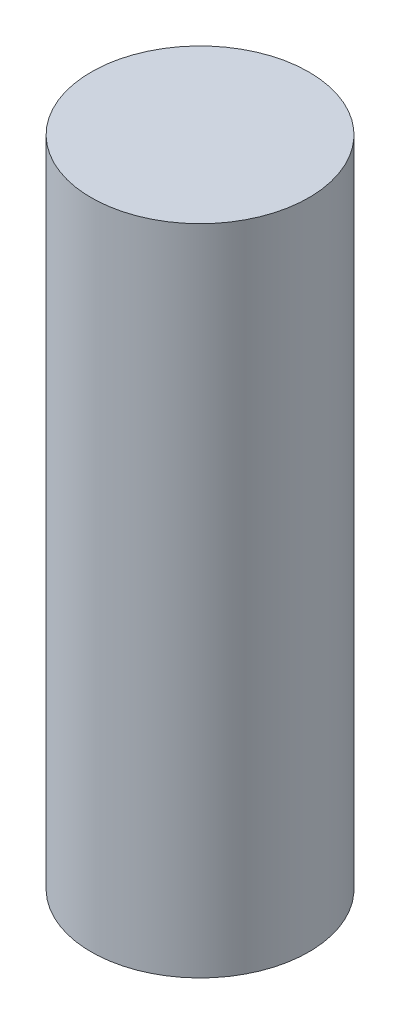
ISO-10303-21;
HEADER;
FILE_DESCRIPTION(('STEP AP214'),'2;1');
FILE_NAME('part.step','',(''),(''),'','','');
FILE_SCHEMA(('AUTOMOTIVE_DESIGN { 1 0 10303 214 1 1 1 1 }'));
ENDSEC;
DATA;
#1=APPLICATION_CONTEXT('core data for automotive mechanical design processes');
#2=APPLICATION_PROTOCOL_DEFINITION('international standard','automotive_design',2000,#1);
#3=PRODUCT_CONTEXT('',#1,'mechanical');
#4=PRODUCT('Part','Part','',(#3));
#5=PRODUCT_RELATED_PRODUCT_CATEGORY('part','',(#4));
#6=PRODUCT_DEFINITION_FORMATION('','',#4);
#7=PRODUCT_DEFINITION_CONTEXT('part definition',#1,'design');
#8=PRODUCT_DEFINITION('design','',#6,#7);
#9=PRODUCT_DEFINITION_SHAPE('','',#8);
#10=(LENGTH_UNIT() NAMED_UNIT(*) SI_UNIT(.MILLI.,.METRE.));
#11=(NAMED_UNIT(*) PLANE_ANGLE_UNIT() SI_UNIT($,.RADIAN.));
#12=(NAMED_UNIT(*) SI_UNIT($,.STERADIAN.) SOLID_ANGLE_UNIT());
#13=UNCERTAINTY_MEASURE_WITH_UNIT(LENGTH_MEASURE(1.E-05),#10,'distance_accuracy_value','');
#14=(GEOMETRIC_REPRESENTATION_CONTEXT(3) GLOBAL_UNCERTAINTY_ASSIGNED_CONTEXT((#13)) GLOBAL_UNIT_ASSIGNED_CONTEXT((#10,
#11,#12)) REPRESENTATION_CONTEXT('',''));
#15=CARTESIAN_POINT('',(0.,0.,0.));
#16=DIRECTION('',(0.,0.,1.));
#17=DIRECTION('',(1.,0.,0.));
#18=AXIS2_PLACEMENT_3D('',#15,#16,#17);
#19=CARTESIAN_POINT('',(0.,19.05,0.));
#20=DIRECTION('',(0.,-1.,0.));
#21=DIRECTION('',(0.,0.,-1.));
#22=AXIS2_PLACEMENT_3D('',#19,#20,#21);
#23=CYLINDRICAL_SURFACE('',#22,3.175);
#24=CARTESIAN_POINT('',(0.,19.05,0.));
#25=DIRECTION('',(0.,1.,0.));
#26=DIRECTION('',(0.,0.,1.));
#27=AXIS2_PLACEMENT_3D('',#24,#25,#26);
#28=CIRCLE('',#27,3.175);
#29=CARTESIAN_POINT('',(0.,19.05,-3.175));
#30=VERTEX_POINT('',#29);
#31=EDGE_CURVE('E10',#30,#30,#28,.T.);
#32=CARTESIAN_POINT('',(0.,0.,0.));
#33=DIRECTION('',(0.,1.,0.));
#34=DIRECTION('',(0.,0.,1.));
#35=AXIS2_PLACEMENT_3D('',#32,#33,#34);
#36=CIRCLE('',#35,3.175);
#37=CARTESIAN_POINT('',(0.,0.,-3.175));
#38=VERTEX_POINT('',#37);
#39=EDGE_CURVE('E34',#38,#38,#36,.T.);
#40=CARTESIAN_POINT('',(0.,19.05,-3.175));
#41=CARTESIAN_POINT('',(0.,18.8515625,-3.175));
#42=CARTESIAN_POINT('',(0.,18.653125,-3.175));
#43=CARTESIAN_POINT('',(0.,18.25625,-3.175));
#44=CARTESIAN_POINT('',(0.,18.0578125,-3.175));
#45=CARTESIAN_POINT('',(0.,17.6609375,-3.175));
#46=CARTESIAN_POINT('',(0.,17.4625,-3.175));
#47=CARTESIAN_POINT('',(0.,17.065625,-3.175));
#48=CARTESIAN_POINT('',(0.,16.8671875,-3.175));
#49=CARTESIAN_POINT('',(0.,16.4703125,-3.175));
#50=CARTESIAN_POINT('',(0.,16.271875,-3.175));
#51=CARTESIAN_POINT('',(0.,15.875,-3.175));
#52=CARTESIAN_POINT('',(0.,15.6765625,-3.175));
#53=CARTESIAN_POINT('',(0.,15.2796875,-3.175));
#54=CARTESIAN_POINT('',(0.,15.08125,-3.175));
#55=CARTESIAN_POINT('',(0.,14.684375,-3.175));
#56=CARTESIAN_POINT('',(0.,14.4859375,-3.175));
#57=CARTESIAN_POINT('',(0.,14.0890625,-3.175));
#58=CARTESIAN_POINT('',(0.,13.890625,-3.175));
#59=CARTESIAN_POINT('',(0.,13.49375,-3.175));
#60=CARTESIAN_POINT('',(0.,13.2953125,-3.175));
#61=CARTESIAN_POINT('',(0.,12.8984375,-3.175));
#62=CARTESIAN_POINT('',(0.,12.7,-3.175));
#63=CARTESIAN_POINT('',(0.,12.303125,-3.175));
#64=CARTESIAN_POINT('',(0.,12.1046875,-3.175));
#65=CARTESIAN_POINT('',(0.,11.7078125,-3.175));
#66=CARTESIAN_POINT('',(0.,11.509375,-3.175));
#67=CARTESIAN_POINT('',(0.,11.1125,-3.175));
#68=CARTESIAN_POINT('',(0.,10.9140625,-3.175));
#69=CARTESIAN_POINT('',(0.,10.5171875,-3.175));
#70=CARTESIAN_POINT('',(0.,10.31875,-3.175));
#71=CARTESIAN_POINT('',(0.,9.921875,-3.175));
#72=CARTESIAN_POINT('',(0.,9.7234375,-3.175));
#73=CARTESIAN_POINT('',(0.,9.3265625,-3.175));
#74=CARTESIAN_POINT('',(0.,9.128125,-3.175));
#75=CARTESIAN_POINT('',(0.,8.73125,-3.175));
#76=CARTESIAN_POINT('',(0.,8.5328125,-3.175));
#77=CARTESIAN_POINT('',(0.,8.1359375,-3.175));
#78=CARTESIAN_POINT('',(0.,7.9375,-3.175));
#79=CARTESIAN_POINT('',(0.,7.540625,-3.175));
#80=CARTESIAN_POINT('',(0.,7.3421875,-3.175));
#81=CARTESIAN_POINT('',(0.,6.9453125,-3.175));
#82=CARTESIAN_POINT('',(0.,6.746875,-3.175));
#83=CARTESIAN_POINT('',(0.,6.35,-3.175));
#84=CARTESIAN_POINT('',(0.,6.1515625,-3.175));
#85=CARTESIAN_POINT('',(0.,5.7546875,-3.175));
#86=CARTESIAN_POINT('',(0.,5.55625,-3.175));
#87=CARTESIAN_POINT('',(0.,5.159375,-3.175));
#88=CARTESIAN_POINT('',(0.,4.9609375,-3.175));
#89=CARTESIAN_POINT('',(0.,4.5640625,-3.175));
#90=CARTESIAN_POINT('',(0.,4.365625,-3.175));
#91=CARTESIAN_POINT('',(0.,3.96875,-3.175));
#92=CARTESIAN_POINT('',(0.,3.7703125,-3.175));
#93=CARTESIAN_POINT('',(0.,3.3734375,-3.175));
#94=CARTESIAN_POINT('',(0.,3.175,-3.175));
#95=CARTESIAN_POINT('',(0.,2.778125,-3.175));
#96=CARTESIAN_POINT('',(0.,2.5796875,-3.175));
#97=CARTESIAN_POINT('',(0.,2.1828125,-3.175));
#98=CARTESIAN_POINT('',(0.,1.984375,-3.175));
#99=CARTESIAN_POINT('',(0.,1.5875,-3.175));
#100=CARTESIAN_POINT('',(0.,1.3890625,-3.175));
#101=CARTESIAN_POINT('',(0.,0.992187500000001,-3.175));
#102=CARTESIAN_POINT('',(0.,0.793750000000001,-3.175));
#103=CARTESIAN_POINT('',(0.,0.396875,-3.175));
#104=CARTESIAN_POINT('',(0.,0.1984375,-3.175));
#105=CARTESIAN_POINT('',(0.,0.,-3.175));
#106=B_SPLINE_CURVE_WITH_KNOTS('',3,(#40,#41,#42,#43,#44,#45,#46,#47,#48,#49,#50,#51,#52,#53,
#54,#55,#56,#57,#58,#59,#60,#61,#62,#63,#64,#65,#66,#67,#68,#69,#70,#71,#72,#73,#74,#75,#76,#77,
#78,#79,#80,#81,#82,#83,#84,#85,#86,#87,#88,#89,#90,#91,#92,#93,#94,#95,#96,#97,#98,#99,#100,
#101,#102,#103,#104,#105),.UNSPECIFIED.,.F.,.F.,(4,2,2,2,2,2,2,2,2,2,2,2,2,2,2,2,2,2,2,2,2,2,2,
2,2,2,2,2,2,2,2,2,4),(0.,0.595312499999997,1.190625,1.7859375,2.38125,2.9765625,3.571875,
4.1671875,4.7625,5.3578125,5.953125,6.5484375,7.14375,7.7390625,8.334375,8.9296875,9.525,
10.1203125,10.715625,11.3109375,11.90625,12.5015625,13.096875,13.6921875,14.2875,14.8828125,
15.478125,16.0734375,16.66875,17.2640625,17.859375,18.4546875,19.05),.UNSPECIFIED.);
#107=EDGE_CURVE('BSEAM31',#30,#38,#106,.T.);
#108=ORIENTED_EDGE('',*,*,#31,.F.);
#109=ORIENTED_EDGE('',*,*,#39,.T.);
#110=ORIENTED_EDGE('',*,*,#107,.T.);
#111=ORIENTED_EDGE('',*,*,#107,.F.);
#112=EDGE_LOOP('',(#108,#110,#109,#111));
#113=FACE_BOUND('',#112,.T.);
#114=ADVANCED_FACE('F31',(#113),#23,.T.);
#115=CARTESIAN_POINT('',(0.,19.05,0.));
#116=DIRECTION('',(0.,1.,0.));
#117=DIRECTION('',(0.,0.,1.));
#118=AXIS2_PLACEMENT_3D('',#115,#116,#117);
#119=PLANE('',#118);
#120=ORIENTED_EDGE('',*,*,#31,.T.);
#121=EDGE_LOOP('',(#120));
#122=FACE_BOUND('',#121,.T.);
#123=ADVANCED_FACE('F46',(#122),#119,.T.);
#124=CARTESIAN_POINT('',(0.,0.,0.));
#125=DIRECTION('',(0.,1.,0.));
#126=DIRECTION('',(0.,0.,1.));
#127=AXIS2_PLACEMENT_3D('',#124,#125,#126);
#128=PLANE('',#127);
#129=ORIENTED_EDGE('',*,*,#39,.F.);
#130=EDGE_LOOP('',(#129));
#131=FACE_BOUND('',#130,.T.);
#132=ADVANCED_FACE('F44',(#131),#128,.F.);
#133=CLOSED_SHELL('',(#114,#123,#132));
#134=MANIFOLD_SOLID_BREP('B2',#133);
#135=ADVANCED_BREP_SHAPE_REPRESENTATION('',(#18,#134),#14);
#136=SHAPE_DEFINITION_REPRESENTATION(#9,#135);
ENDSEC;
END-ISO-10303-21;
